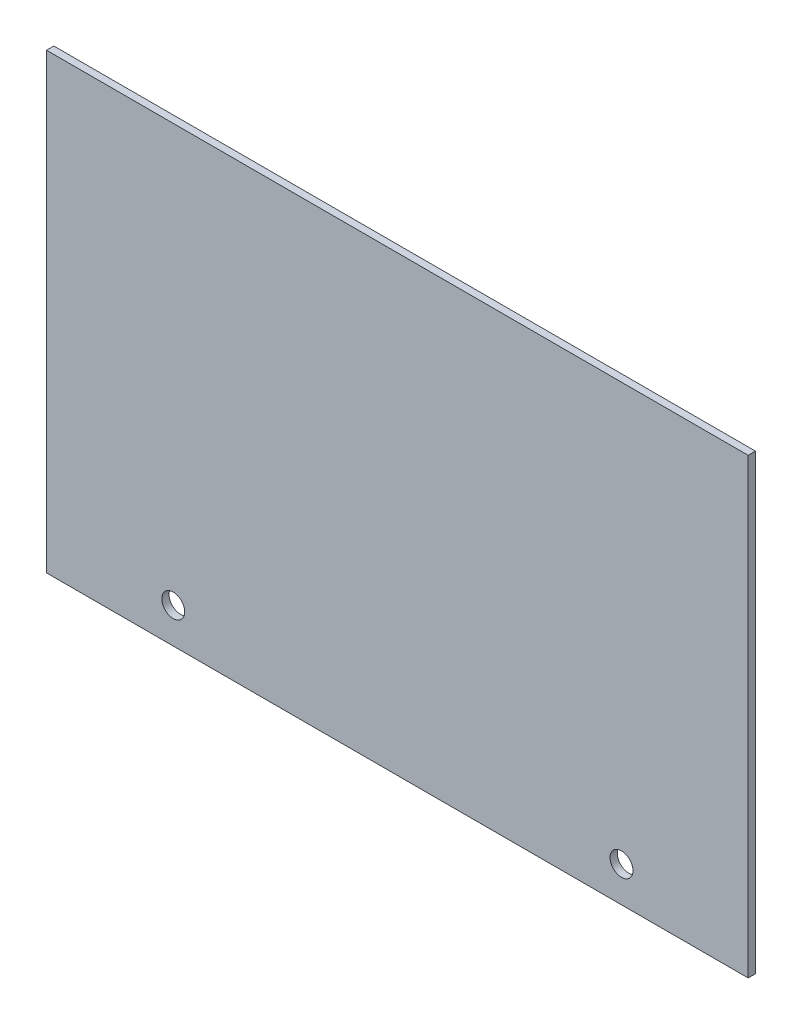
ISO-10303-21;
HEADER;
FILE_DESCRIPTION(('STEP AP214'),'2;1');
FILE_NAME('part.step','',(''),(''),'','','');
FILE_SCHEMA(('AUTOMOTIVE_DESIGN { 1 0 10303 214 1 1 1 1 }'));
ENDSEC;
DATA;
#1=APPLICATION_CONTEXT('core data for automotive mechanical design processes');
#2=APPLICATION_PROTOCOL_DEFINITION('international standard','automotive_design',2000,#1);
#3=PRODUCT_CONTEXT('',#1,'mechanical');
#4=PRODUCT('Part','Part','',(#3));
#5=PRODUCT_RELATED_PRODUCT_CATEGORY('part','',(#4));
#6=PRODUCT_DEFINITION_FORMATION('','',#4);
#7=PRODUCT_DEFINITION_CONTEXT('part definition',#1,'design');
#8=PRODUCT_DEFINITION('design','',#6,#7);
#9=PRODUCT_DEFINITION_SHAPE('','',#8);
#10=(LENGTH_UNIT() NAMED_UNIT(*) SI_UNIT(.MILLI.,.METRE.));
#11=(NAMED_UNIT(*) PLANE_ANGLE_UNIT() SI_UNIT($,.RADIAN.));
#12=(NAMED_UNIT(*) SI_UNIT($,.STERADIAN.) SOLID_ANGLE_UNIT());
#13=UNCERTAINTY_MEASURE_WITH_UNIT(LENGTH_MEASURE(1.E-05),#10,'distance_accuracy_value','');
#14=(GEOMETRIC_REPRESENTATION_CONTEXT(3) GLOBAL_UNCERTAINTY_ASSIGNED_CONTEXT((#13)) GLOBAL_UNIT_ASSIGNED_CONTEXT((#10,
#11,#12)) REPRESENTATION_CONTEXT('',''));
#15=CARTESIAN_POINT('',(0.,0.,0.));
#16=DIRECTION('',(0.,0.,1.));
#17=DIRECTION('',(1.,0.,0.));
#18=AXIS2_PLACEMENT_3D('',#15,#16,#17);
#19=CARTESIAN_POINT('',(-153.025,0.,3.175));
#20=DIRECTION('',(1.,0.,0.));
#21=DIRECTION('',(0.,1.,0.));
#22=AXIS2_PLACEMENT_3D('',#19,#20,#21);
#23=PLANE('',#22);
#24=DIRECTION('',(0.,-1.,0.));
#25=VECTOR('',#24,1.);
#26=CARTESIAN_POINT('',(-153.025,0.,0.));
#27=LINE('',#26,#25);
#28=CARTESIAN_POINT('',(-153.025,98.7125,0.));
#29=VERTEX_POINT('',#28);
#30=CARTESIAN_POINT('',(-153.025,-98.7125,0.));
#31=VERTEX_POINT('',#30);
#32=EDGE_CURVE('E102',#29,#31,#27,.T.);
#33=ORIENTED_EDGE('',*,*,#32,.T.);
#34=DIRECTION('',(0.,0.,-1.));
#35=VECTOR('',#34,1.);
#36=CARTESIAN_POINT('',(-153.025,-98.7125,3.175));
#37=LINE('',#36,#35);
#38=CARTESIAN_POINT('',(-153.025,-98.7125,3.175));
#39=VERTEX_POINT('',#38);
#40=EDGE_CURVE('E11',#39,#31,#37,.T.);
#41=ORIENTED_EDGE('',*,*,#40,.F.);
#42=DIRECTION('',(0.,-1.,0.));
#43=VECTOR('',#42,1.);
#44=CARTESIAN_POINT('',(-153.025,0.,3.175));
#45=LINE('',#44,#43);
#46=CARTESIAN_POINT('',(-153.025,98.7125,3.175));
#47=VERTEX_POINT('',#46);
#48=EDGE_CURVE('E88',#47,#39,#45,.T.);
#49=ORIENTED_EDGE('',*,*,#48,.F.);
#50=DIRECTION('',(0.,0.,-1.));
#51=VECTOR('',#50,1.);
#52=CARTESIAN_POINT('',(-153.025,98.7125,3.175));
#53=LINE('',#52,#51);
#54=EDGE_CURVE('E55',#47,#29,#53,.T.);
#55=ORIENTED_EDGE('',*,*,#54,.T.);
#56=EDGE_LOOP('',(#33,#41,#49,#55));
#57=FACE_BOUND('',#56,.T.);
#58=ADVANCED_FACE('F39',(#57),#23,.F.);
#59=CARTESIAN_POINT('',(0.,-98.7125,3.175));
#60=DIRECTION('',(0.,1.,0.));
#61=DIRECTION('',(0.,0.,1.));
#62=AXIS2_PLACEMENT_3D('',#59,#60,#61);
#63=PLANE('',#62);
#64=DIRECTION('',(1.,0.,0.));
#65=VECTOR('',#64,1.);
#66=CARTESIAN_POINT('',(0.,-98.7125,0.));
#67=LINE('',#66,#65);
#68=CARTESIAN_POINT('',(153.025,-98.7125,0.));
#69=VERTEX_POINT('',#68);
#70=EDGE_CURVE('E93',#31,#69,#67,.T.);
#71=ORIENTED_EDGE('',*,*,#70,.T.);
#72=DIRECTION('',(0.,0.,-1.));
#73=VECTOR('',#72,1.);
#74=CARTESIAN_POINT('',(153.025,-98.7125,3.175));
#75=LINE('',#74,#73);
#76=CARTESIAN_POINT('',(153.025,-98.7125,3.175));
#77=VERTEX_POINT('',#76);
#78=EDGE_CURVE('E47',#77,#69,#75,.T.);
#79=ORIENTED_EDGE('',*,*,#78,.F.);
#80=DIRECTION('',(1.,0.,0.));
#81=VECTOR('',#80,1.);
#82=CARTESIAN_POINT('',(0.,-98.7125,3.175));
#83=LINE('',#82,#81);
#84=EDGE_CURVE('E80',#39,#77,#83,.T.);
#85=ORIENTED_EDGE('',*,*,#84,.F.);
#86=ORIENTED_EDGE('',*,*,#40,.T.);
#87=EDGE_LOOP('',(#71,#79,#85,#86));
#88=FACE_BOUND('',#87,.T.);
#89=ADVANCED_FACE('F92',(#88),#63,.F.);
#90=CARTESIAN_POINT('',(153.025,0.,3.175));
#91=DIRECTION('',(1.,0.,0.));
#92=DIRECTION('',(0.,1.,0.));
#93=AXIS2_PLACEMENT_3D('',#90,#91,#92);
#94=PLANE('',#93);
#95=DIRECTION('',(0.,-1.,0.));
#96=VECTOR('',#95,1.);
#97=CARTESIAN_POINT('',(153.025,0.,0.));
#98=LINE('',#97,#96);
#99=CARTESIAN_POINT('',(153.025,98.7125,0.));
#100=VERTEX_POINT('',#99);
#101=EDGE_CURVE('E106',#100,#69,#98,.T.);
#102=ORIENTED_EDGE('',*,*,#101,.F.);
#103=DIRECTION('',(0.,0.,-1.));
#104=VECTOR('',#103,1.);
#105=CARTESIAN_POINT('',(153.025,98.7125,3.175));
#106=LINE('',#105,#104);
#107=CARTESIAN_POINT('',(153.025,98.7125,3.175));
#108=VERTEX_POINT('',#107);
#109=EDGE_CURVE('E69',#108,#100,#106,.T.);
#110=ORIENTED_EDGE('',*,*,#109,.F.);
#111=DIRECTION('',(0.,-1.,0.));
#112=VECTOR('',#111,1.);
#113=CARTESIAN_POINT('',(153.025,0.,3.175));
#114=LINE('',#113,#112);
#115=EDGE_CURVE('E87',#108,#77,#114,.T.);
#116=ORIENTED_EDGE('',*,*,#115,.T.);
#117=ORIENTED_EDGE('',*,*,#78,.T.);
#118=EDGE_LOOP('',(#102,#110,#116,#117));
#119=FACE_BOUND('',#118,.T.);
#120=ADVANCED_FACE('F96',(#119),#94,.T.);
#121=CARTESIAN_POINT('',(0.,98.7125,3.175));
#122=DIRECTION('',(0.,1.,0.));
#123=DIRECTION('',(0.,0.,1.));
#124=AXIS2_PLACEMENT_3D('',#121,#122,#123);
#125=PLANE('',#124);
#126=DIRECTION('',(1.,0.,0.));
#127=VECTOR('',#126,1.);
#128=CARTESIAN_POINT('',(0.,98.7125,0.));
#129=LINE('',#128,#127);
#130=EDGE_CURVE('E108',#29,#100,#129,.T.);
#131=ORIENTED_EDGE('',*,*,#130,.F.);
#132=ORIENTED_EDGE('',*,*,#54,.F.);
#133=DIRECTION('',(1.,0.,0.));
#134=VECTOR('',#133,1.);
#135=CARTESIAN_POINT('',(0.,98.7125,3.175));
#136=LINE('',#135,#134);
#137=EDGE_CURVE('E97',#47,#108,#136,.T.);
#138=ORIENTED_EDGE('',*,*,#137,.T.);
#139=ORIENTED_EDGE('',*,*,#109,.T.);
#140=EDGE_LOOP('',(#131,#132,#138,#139));
#141=FACE_BOUND('',#140,.T.);
#142=ADVANCED_FACE('F132',(#141),#125,.T.);
#143=CARTESIAN_POINT('',(0.,0.,3.175));
#144=DIRECTION('',(0.,0.,1.));
#145=DIRECTION('',(1.,0.,0.));
#146=AXIS2_PLACEMENT_3D('',#143,#144,#145);
#147=PLANE('',#146);
#148=CARTESIAN_POINT('',(-97.7500000000036,-83.3339999999321,3.175));
#149=DIRECTION('',(0.,0.,1.));
#150=DIRECTION('',(1.,0.,0.));
#151=AXIS2_PLACEMENT_3D('',#148,#149,#150);
#152=CIRCLE('',#151,5.00000000000001);
#153=CARTESIAN_POINT('',(-92.7500000000036,-83.3339999999321,3.175));
#154=VERTEX_POINT('',#153);
#155=EDGE_CURVE('E117',#154,#154,#152,.T.);
#156=ORIENTED_EDGE('',*,*,#155,.F.);
#157=EDGE_LOOP('',(#156));
#158=FACE_BOUND('',#157,.T.);
#159=CARTESIAN_POINT('',(97.7500000000036,-83.3339999999321,3.175));
#160=DIRECTION('',(0.,0.,-1.));
#161=DIRECTION('',(-1.,0.,0.));
#162=AXIS2_PLACEMENT_3D('',#159,#160,#161);
#163=CIRCLE('',#162,5.00000000000001);
#164=CARTESIAN_POINT('',(92.7500000000036,-83.3339999999321,3.175));
#165=VERTEX_POINT('',#164);
#166=EDGE_CURVE('E104',#165,#165,#163,.T.);
#167=ORIENTED_EDGE('',*,*,#166,.T.);
#168=EDGE_LOOP('',(#167));
#169=FACE_BOUND('',#168,.T.);
#170=ORIENTED_EDGE('',*,*,#48,.T.);
#171=ORIENTED_EDGE('',*,*,#84,.T.);
#172=ORIENTED_EDGE('',*,*,#115,.F.);
#173=ORIENTED_EDGE('',*,*,#137,.F.);
#174=EDGE_LOOP('',(#170,#171,#172,#173));
#175=FACE_BOUND('',#174,.T.);
#176=ADVANCED_FACE('F84',(#158,#169,#175),#147,.T.);
#177=CARTESIAN_POINT('',(0.,0.,0.));
#178=DIRECTION('',(0.,0.,1.));
#179=DIRECTION('',(1.,0.,0.));
#180=AXIS2_PLACEMENT_3D('',#177,#178,#179);
#181=PLANE('',#180);
#182=CARTESIAN_POINT('',(-97.7500000000036,-83.3339999999321,0.));
#183=DIRECTION('',(0.,0.,1.));
#184=DIRECTION('',(1.,0.,0.));
#185=AXIS2_PLACEMENT_3D('',#182,#183,#184);
#186=CIRCLE('',#185,5.00000000000001);
#187=CARTESIAN_POINT('',(-92.7500000000036,-83.3339999999321,0.));
#188=VERTEX_POINT('',#187);
#189=EDGE_CURVE('E120',#188,#188,#186,.T.);
#190=ORIENTED_EDGE('',*,*,#189,.T.);
#191=EDGE_LOOP('',(#190));
#192=FACE_BOUND('',#191,.T.);
#193=CARTESIAN_POINT('',(97.7500000000036,-83.3339999999321,0.));
#194=DIRECTION('',(0.,0.,-1.));
#195=DIRECTION('',(-1.,0.,0.));
#196=AXIS2_PLACEMENT_3D('',#193,#194,#195);
#197=CIRCLE('',#196,5.00000000000001);
#198=CARTESIAN_POINT('',(92.7500000000036,-83.3339999999321,0.));
#199=VERTEX_POINT('',#198);
#200=EDGE_CURVE('E114',#199,#199,#197,.T.);
#201=ORIENTED_EDGE('',*,*,#200,.F.);
#202=EDGE_LOOP('',(#201));
#203=FACE_BOUND('',#202,.T.);
#204=ORIENTED_EDGE('',*,*,#32,.F.);
#205=ORIENTED_EDGE('',*,*,#130,.T.);
#206=ORIENTED_EDGE('',*,*,#101,.T.);
#207=ORIENTED_EDGE('',*,*,#70,.F.);
#208=EDGE_LOOP('',(#204,#205,#206,#207));
#209=FACE_BOUND('',#208,.T.);
#210=ADVANCED_FACE('F131',(#192,#203,#209),#181,.F.);
#211=CARTESIAN_POINT('',(97.7500000000036,-83.3339999999321,3.175));
#212=DIRECTION('',(0.,0.,-1.));
#213=DIRECTION('',(-1.,0.,0.));
#214=AXIS2_PLACEMENT_3D('',#211,#212,#213);
#215=CYLINDRICAL_SURFACE('',#214,5.00000000000001);
#216=ORIENTED_EDGE('',*,*,#166,.F.);
#217=EDGE_LOOP('',(#216));
#218=FACE_BOUND('',#217,.T.);
#219=ORIENTED_EDGE('',*,*,#200,.T.);
#220=EDGE_LOOP('',(#219));
#221=FACE_BOUND('',#220,.T.);
#222=ADVANCED_FACE('F136',(#218,#221),#215,.F.);
#223=CARTESIAN_POINT('',(-97.7500000000036,-83.3339999999321,3.175));
#224=DIRECTION('',(0.,0.,-1.));
#225=DIRECTION('',(-1.,0.,0.));
#226=AXIS2_PLACEMENT_3D('',#223,#224,#225);
#227=CYLINDRICAL_SURFACE('',#226,5.00000000000001);
#228=ORIENTED_EDGE('',*,*,#155,.T.);
#229=EDGE_LOOP('',(#228));
#230=FACE_BOUND('',#229,.T.);
#231=ORIENTED_EDGE('',*,*,#189,.F.);
#232=EDGE_LOOP('',(#231));
#233=FACE_BOUND('',#232,.T.);
#234=ADVANCED_FACE('F126',(#230,#233),#227,.F.);
#235=CLOSED_SHELL('',(#58,#89,#120,#142,#176,#210,#222,#234));
#236=MANIFOLD_SOLID_BREP('B2',#235);
#237=ADVANCED_BREP_SHAPE_REPRESENTATION('',(#18,#236),#14);
#238=SHAPE_DEFINITION_REPRESENTATION(#9,#237);
ENDSEC;
END-ISO-10303-21;
